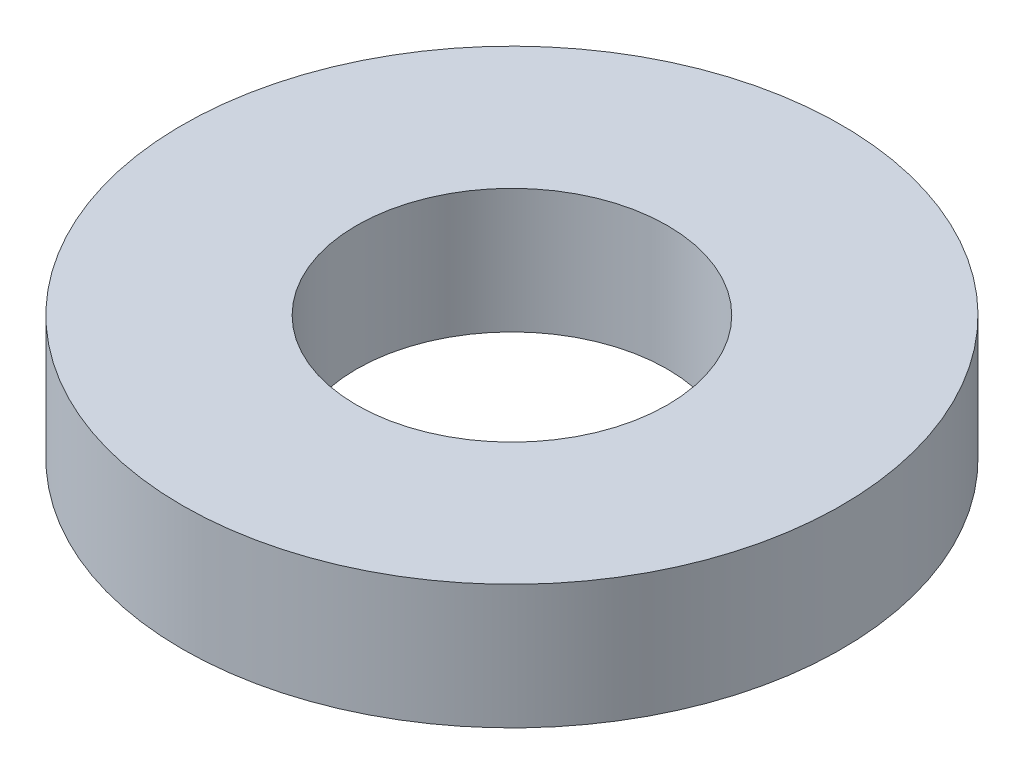
ISO-10303-21;
HEADER;
FILE_DESCRIPTION(('STEP AP214'),'2;1');
FILE_NAME('part.step','',(''),(''),'','','');
FILE_SCHEMA(('AUTOMOTIVE_DESIGN { 1 0 10303 214 1 1 1 1 }'));
ENDSEC;
DATA;
#1=APPLICATION_CONTEXT('core data for automotive mechanical design processes');
#2=APPLICATION_PROTOCOL_DEFINITION('international standard','automotive_design',2000,#1);
#3=PRODUCT_CONTEXT('',#1,'mechanical');
#4=PRODUCT('Part','Part','',(#3));
#5=PRODUCT_RELATED_PRODUCT_CATEGORY('part','',(#4));
#6=PRODUCT_DEFINITION_FORMATION('','',#4);
#7=PRODUCT_DEFINITION_CONTEXT('part definition',#1,'design');
#8=PRODUCT_DEFINITION('design','',#6,#7);
#9=PRODUCT_DEFINITION_SHAPE('','',#8);
#10=(LENGTH_UNIT() NAMED_UNIT(*) SI_UNIT(.MILLI.,.METRE.));
#11=(NAMED_UNIT(*) PLANE_ANGLE_UNIT() SI_UNIT($,.RADIAN.));
#12=(NAMED_UNIT(*) SI_UNIT($,.STERADIAN.) SOLID_ANGLE_UNIT());
#13=UNCERTAINTY_MEASURE_WITH_UNIT(LENGTH_MEASURE(1.E-05),#10,'distance_accuracy_value','');
#14=(GEOMETRIC_REPRESENTATION_CONTEXT(3) GLOBAL_UNCERTAINTY_ASSIGNED_CONTEXT((#13)) GLOBAL_UNIT_ASSIGNED_CONTEXT((#10,
#11,#12)) REPRESENTATION_CONTEXT('',''));
#15=CARTESIAN_POINT('',(0.,0.,0.));
#16=DIRECTION('',(0.,0.,1.));
#17=DIRECTION('',(1.,0.,0.));
#18=AXIS2_PLACEMENT_3D('',#15,#16,#17);
#19=CARTESIAN_POINT('',(0.,2.54,0.));
#20=DIRECTION('',(0.,-1.,0.));
#21=DIRECTION('',(0.,0.,-1.));
#22=AXIS2_PLACEMENT_3D('',#19,#20,#21);
#23=CYLINDRICAL_SURFACE('',#22,6.731);
#24=CARTESIAN_POINT('',(0.,2.54,0.));
#25=DIRECTION('',(0.,1.,0.));
#26=DIRECTION('',(0.,0.,1.));
#27=AXIS2_PLACEMENT_3D('',#24,#25,#26);
#28=CIRCLE('',#27,6.731);
#29=CARTESIAN_POINT('',(0.,2.54,6.731));
#30=VERTEX_POINT('',#29);
#31=EDGE_CURVE('E10',#30,#30,#28,.T.);
#32=ORIENTED_EDGE('',*,*,#31,.F.);
#33=EDGE_LOOP('',(#32));
#34=FACE_BOUND('',#33,.T.);
#35=CARTESIAN_POINT('',(0.,0.,0.));
#36=DIRECTION('',(0.,1.,0.));
#37=DIRECTION('',(0.,0.,1.));
#38=AXIS2_PLACEMENT_3D('',#35,#36,#37);
#39=CIRCLE('',#38,6.731);
#40=CARTESIAN_POINT('',(0.,0.,6.731));
#41=VERTEX_POINT('',#40);
#42=EDGE_CURVE('E36',#41,#41,#39,.T.);
#43=ORIENTED_EDGE('',*,*,#42,.T.);
#44=EDGE_LOOP('',(#43));
#45=FACE_BOUND('',#44,.T.);
#46=ADVANCED_FACE('F33',(#34,#45),#23,.T.);
#47=CARTESIAN_POINT('',(0.,2.54,0.));
#48=DIRECTION('',(0.,1.,0.));
#49=DIRECTION('',(0.,0.,1.));
#50=AXIS2_PLACEMENT_3D('',#47,#48,#49);
#51=PLANE('',#50);
#52=CARTESIAN_POINT('',(0.,2.54,0.));
#53=DIRECTION('',(0.,1.,0.));
#54=DIRECTION('',(0.,0.,1.));
#55=AXIS2_PLACEMENT_3D('',#52,#53,#54);
#56=CIRCLE('',#55,3.175);
#57=CARTESIAN_POINT('',(0.,2.54,3.175));
#58=VERTEX_POINT('',#57);
#59=EDGE_CURVE('E47',#58,#58,#56,.T.);
#60=ORIENTED_EDGE('',*,*,#59,.F.);
#61=EDGE_LOOP('',(#60));
#62=FACE_BOUND('',#61,.T.);
#63=ORIENTED_EDGE('',*,*,#31,.T.);
#64=EDGE_LOOP('',(#63));
#65=FACE_BOUND('',#64,.T.);
#66=ADVANCED_FACE('F53',(#62,#65),#51,.T.);
#67=CARTESIAN_POINT('',(0.,0.,0.));
#68=DIRECTION('',(0.,1.,0.));
#69=DIRECTION('',(0.,0.,1.));
#70=AXIS2_PLACEMENT_3D('',#67,#68,#69);
#71=PLANE('',#70);
#72=CARTESIAN_POINT('',(0.,0.,0.));
#73=DIRECTION('',(0.,1.,0.));
#74=DIRECTION('',(0.,0.,1.));
#75=AXIS2_PLACEMENT_3D('',#72,#73,#74);
#76=CIRCLE('',#75,3.175);
#77=CARTESIAN_POINT('',(0.,0.,3.175));
#78=VERTEX_POINT('',#77);
#79=EDGE_CURVE('E43',#78,#78,#76,.T.);
#80=ORIENTED_EDGE('',*,*,#79,.T.);
#81=EDGE_LOOP('',(#80));
#82=FACE_BOUND('',#81,.T.);
#83=ORIENTED_EDGE('',*,*,#42,.F.);
#84=EDGE_LOOP('',(#83));
#85=FACE_BOUND('',#84,.T.);
#86=ADVANCED_FACE('F55',(#82,#85),#71,.F.);
#87=CARTESIAN_POINT('',(0.,2.54,0.));
#88=DIRECTION('',(0.,1.,0.));
#89=DIRECTION('',(0.,0.,1.));
#90=AXIS2_PLACEMENT_3D('',#87,#88,#89);
#91=CYLINDRICAL_SURFACE('',#90,3.175);
#92=ORIENTED_EDGE('',*,*,#79,.F.);
#93=EDGE_LOOP('',(#92));
#94=FACE_BOUND('',#93,.T.);
#95=ORIENTED_EDGE('',*,*,#59,.T.);
#96=EDGE_LOOP('',(#95));
#97=FACE_BOUND('',#96,.T.);
#98=ADVANCED_FACE('F51',(#94,#97),#91,.F.);
#99=CLOSED_SHELL('',(#46,#66,#86,#98));
#100=MANIFOLD_SOLID_BREP('B2',#99);
#101=ADVANCED_BREP_SHAPE_REPRESENTATION('',(#18,#100),#14);
#102=SHAPE_DEFINITION_REPRESENTATION(#9,#101);
ENDSEC;
END-ISO-10303-21;
